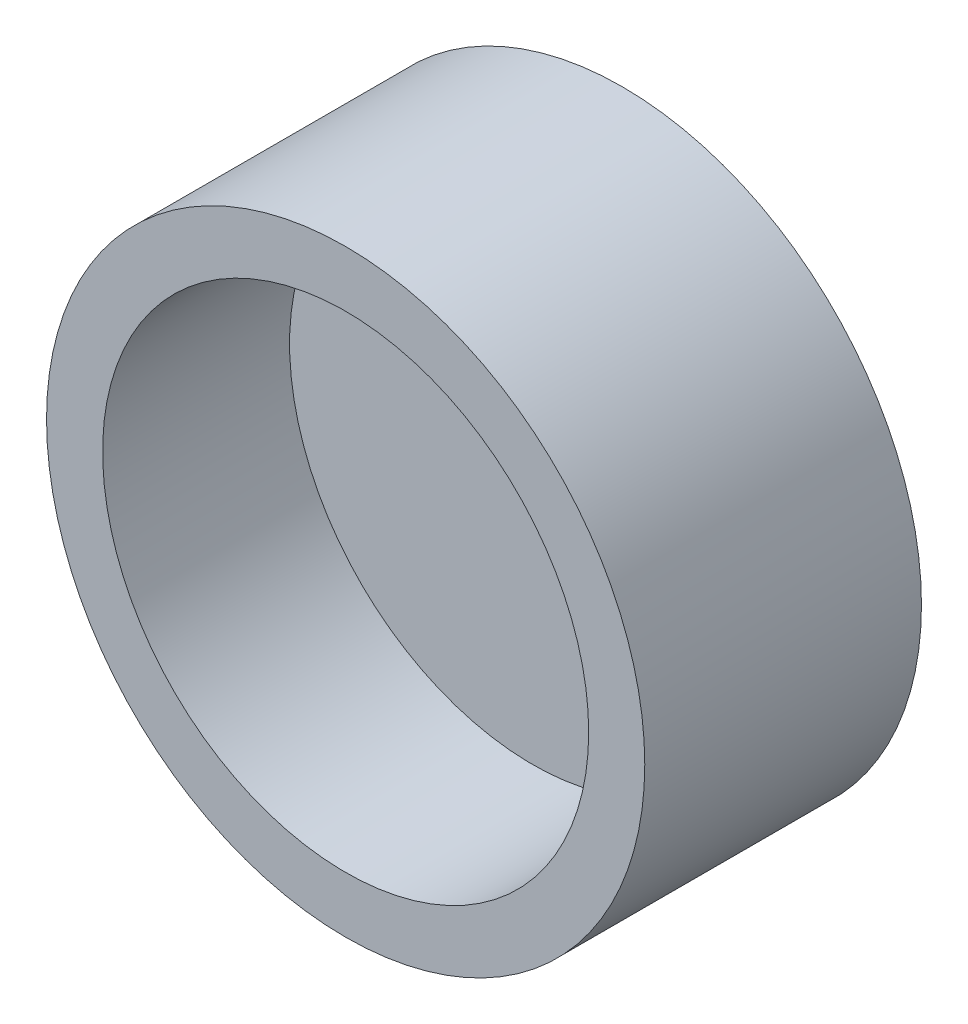
ISO-10303-21;
HEADER;
FILE_DESCRIPTION(('STEP AP214'),'2;1');
FILE_NAME('part.step','',(''),(''),'','','');
FILE_SCHEMA(('AUTOMOTIVE_DESIGN { 1 0 10303 214 1 1 1 1 }'));
ENDSEC;
DATA;
#1=APPLICATION_CONTEXT('core data for automotive mechanical design processes');
#2=APPLICATION_PROTOCOL_DEFINITION('international standard','automotive_design',2000,#1);
#3=PRODUCT_CONTEXT('',#1,'mechanical');
#4=PRODUCT('Part','Part','',(#3));
#5=PRODUCT_RELATED_PRODUCT_CATEGORY('part','',(#4));
#6=PRODUCT_DEFINITION_FORMATION('','',#4);
#7=PRODUCT_DEFINITION_CONTEXT('part definition',#1,'design');
#8=PRODUCT_DEFINITION('design','',#6,#7);
#9=PRODUCT_DEFINITION_SHAPE('','',#8);
#10=(LENGTH_UNIT() NAMED_UNIT(*) SI_UNIT(.MILLI.,.METRE.));
#11=(NAMED_UNIT(*) PLANE_ANGLE_UNIT() SI_UNIT($,.RADIAN.));
#12=(NAMED_UNIT(*) SI_UNIT($,.STERADIAN.) SOLID_ANGLE_UNIT());
#13=UNCERTAINTY_MEASURE_WITH_UNIT(LENGTH_MEASURE(1.E-05),#10,'distance_accuracy_value','');
#14=(GEOMETRIC_REPRESENTATION_CONTEXT(3) GLOBAL_UNCERTAINTY_ASSIGNED_CONTEXT((#13)) GLOBAL_UNIT_ASSIGNED_CONTEXT((#10,
#11,#12)) REPRESENTATION_CONTEXT('',''));
#15=CARTESIAN_POINT('',(0.,0.,0.));
#16=DIRECTION('',(0.,0.,1.));
#17=DIRECTION('',(1.,0.,0.));
#18=AXIS2_PLACEMENT_3D('',#15,#16,#17);
#19=CARTESIAN_POINT('',(0.,0.,7.4));
#20=DIRECTION('',(0.,0.,-1.));
#21=DIRECTION('',(-1.,0.,0.));
#22=AXIS2_PLACEMENT_3D('',#19,#20,#21);
#23=CYLINDRICAL_SURFACE('',#22,8.);
#24=CARTESIAN_POINT('',(0.,0.,7.4));
#25=DIRECTION('',(0.,0.,1.));
#26=DIRECTION('',(1.,0.,0.));
#27=AXIS2_PLACEMENT_3D('',#24,#25,#26);
#28=CIRCLE('',#27,8.);
#29=CARTESIAN_POINT('',(8.,0.,7.4));
#30=VERTEX_POINT('',#29);
#31=EDGE_CURVE('E10',#30,#30,#28,.T.);
#32=ORIENTED_EDGE('',*,*,#31,.F.);
#33=EDGE_LOOP('',(#32));
#34=FACE_BOUND('',#33,.T.);
#35=CARTESIAN_POINT('',(0.,0.,0.));
#36=DIRECTION('',(0.,0.,1.));
#37=DIRECTION('',(1.,0.,0.));
#38=AXIS2_PLACEMENT_3D('',#35,#36,#37);
#39=CIRCLE('',#38,8.);
#40=CARTESIAN_POINT('',(8.,0.,0.));
#41=VERTEX_POINT('',#40);
#42=EDGE_CURVE('E35',#41,#41,#39,.T.);
#43=ORIENTED_EDGE('',*,*,#42,.T.);
#44=EDGE_LOOP('',(#43));
#45=FACE_BOUND('',#44,.T.);
#46=ADVANCED_FACE('F32',(#34,#45),#23,.T.);
#47=CARTESIAN_POINT('',(0.,0.,7.4));
#48=DIRECTION('',(0.,0.,1.));
#49=DIRECTION('',(1.,0.,0.));
#50=AXIS2_PLACEMENT_3D('',#47,#48,#49);
#51=PLANE('',#50);
#52=CARTESIAN_POINT('',(0.,0.,7.4));
#53=DIRECTION('',(0.,0.,1.));
#54=DIRECTION('',(1.,0.,0.));
#55=AXIS2_PLACEMENT_3D('',#52,#53,#54);
#56=CIRCLE('',#55,6.5);
#57=CARTESIAN_POINT('',(6.5,0.,7.4));
#58=VERTEX_POINT('',#57);
#59=EDGE_CURVE('E44',#58,#58,#56,.T.);
#60=ORIENTED_EDGE('',*,*,#59,.F.);
#61=EDGE_LOOP('',(#60));
#62=FACE_BOUND('',#61,.T.);
#63=ORIENTED_EDGE('',*,*,#31,.T.);
#64=EDGE_LOOP('',(#63));
#65=FACE_BOUND('',#64,.T.);
#66=ADVANCED_FACE('F59',(#62,#65),#51,.T.);
#67=CARTESIAN_POINT('',(0.,0.,0.));
#68=DIRECTION('',(0.,0.,1.));
#69=DIRECTION('',(1.,0.,0.));
#70=AXIS2_PLACEMENT_3D('',#67,#68,#69);
#71=PLANE('',#70);
#72=ORIENTED_EDGE('',*,*,#42,.F.);
#73=EDGE_LOOP('',(#72));
#74=FACE_BOUND('',#73,.T.);
#75=ADVANCED_FACE('F55',(#74),#71,.F.);
#76=CARTESIAN_POINT('',(0.,0.,2.4));
#77=DIRECTION('',(0.,0.,1.));
#78=DIRECTION('',(1.,0.,0.));
#79=AXIS2_PLACEMENT_3D('',#76,#77,#78);
#80=CYLINDRICAL_SURFACE('',#79,6.5);
#81=CARTESIAN_POINT('',(0.,0.,2.4));
#82=DIRECTION('',(0.,0.,1.));
#83=DIRECTION('',(1.,0.,0.));
#84=AXIS2_PLACEMENT_3D('',#81,#82,#83);
#85=CIRCLE('',#84,6.5);
#86=CARTESIAN_POINT('',(6.5,0.,2.4));
#87=VERTEX_POINT('',#86);
#88=EDGE_CURVE('E42',#87,#87,#85,.T.);
#89=ORIENTED_EDGE('',*,*,#88,.F.);
#90=EDGE_LOOP('',(#89));
#91=FACE_BOUND('',#90,.T.);
#92=ORIENTED_EDGE('',*,*,#59,.T.);
#93=EDGE_LOOP('',(#92));
#94=FACE_BOUND('',#93,.T.);
#95=ADVANCED_FACE('F52',(#91,#94),#80,.F.);
#96=CARTESIAN_POINT('',(0.,0.,2.4));
#97=DIRECTION('',(0.,0.,1.));
#98=DIRECTION('',(1.,0.,0.));
#99=AXIS2_PLACEMENT_3D('',#96,#97,#98);
#100=PLANE('',#99);
#101=ORIENTED_EDGE('',*,*,#88,.T.);
#102=EDGE_LOOP('',(#101));
#103=FACE_BOUND('',#102,.T.);
#104=ADVANCED_FACE('F50',(#103),#100,.T.);
#105=CLOSED_SHELL('',(#46,#66,#75,#95,#104));
#106=MANIFOLD_SOLID_BREP('B2',#105);
#107=ADVANCED_BREP_SHAPE_REPRESENTATION('',(#18,#106),#14);
#108=SHAPE_DEFINITION_REPRESENTATION(#9,#107);
ENDSEC;
END-ISO-10303-21;
